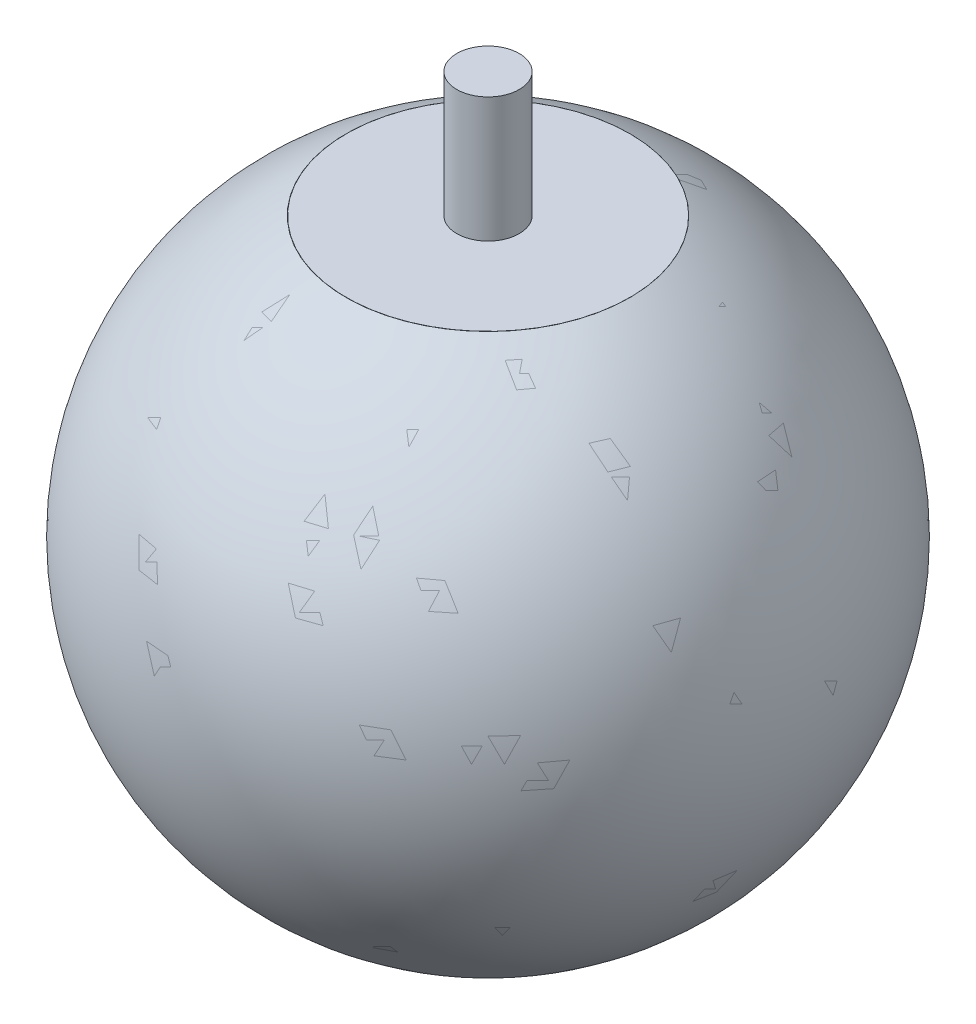
ISO-10303-21;
HEADER;
FILE_DESCRIPTION(('STEP AP214'),'2;1');
FILE_NAME('part.step','',(''),(''),'','','');
FILE_SCHEMA(('AUTOMOTIVE_DESIGN { 1 0 10303 214 1 1 1 1 }'));
ENDSEC;
DATA;
#1=APPLICATION_CONTEXT('core data for automotive mechanical design processes');
#2=APPLICATION_PROTOCOL_DEFINITION('international standard','automotive_design',2000,#1);
#3=PRODUCT_CONTEXT('',#1,'mechanical');
#4=PRODUCT('Part','Part','',(#3));
#5=PRODUCT_RELATED_PRODUCT_CATEGORY('part','',(#4));
#6=PRODUCT_DEFINITION_FORMATION('','',#4);
#7=PRODUCT_DEFINITION_CONTEXT('part definition',#1,'design');
#8=PRODUCT_DEFINITION('design','',#6,#7);
#9=PRODUCT_DEFINITION_SHAPE('','',#8);
#10=(LENGTH_UNIT() NAMED_UNIT(*) SI_UNIT(.MILLI.,.METRE.));
#11=(NAMED_UNIT(*) PLANE_ANGLE_UNIT() SI_UNIT($,.RADIAN.));
#12=(NAMED_UNIT(*) SI_UNIT($,.STERADIAN.) SOLID_ANGLE_UNIT());
#13=UNCERTAINTY_MEASURE_WITH_UNIT(LENGTH_MEASURE(1.E-05),#10,'distance_accuracy_value','');
#14=(GEOMETRIC_REPRESENTATION_CONTEXT(3) GLOBAL_UNCERTAINTY_ASSIGNED_CONTEXT((#13)) GLOBAL_UNIT_ASSIGNED_CONTEXT((#10,
#11,#12)) REPRESENTATION_CONTEXT('',''));
#15=CARTESIAN_POINT('',(0.,0.,0.));
#16=DIRECTION('',(0.,0.,1.));
#17=DIRECTION('',(1.,0.,0.));
#18=AXIS2_PLACEMENT_3D('',#15,#16,#17);
#19=CARTESIAN_POINT('',(0.,0.,0.));
#20=DIRECTION('',(0.,1.,0.));
#21=DIRECTION('',(1.,0.,0.));
#22=AXIS2_PLACEMENT_3D('',#19,#20,#21);
#23=SPHERICAL_SURFACE('',#22,5.);
#24=CARTESIAN_POINT('',(0.,4.45320017350555,0.));
#25=DIRECTION('',(0.,-1.,0.));
#26=DIRECTION('',(0.,0.,-1.));
#27=AXIS2_PLACEMENT_3D('',#24,#25,#26);
#28=CIRCLE('',#27,2.27354529637967);
#29=CARTESIAN_POINT('',(2.27354529637967,4.45320017350555,0.));
#30=VERTEX_POINT('',#29);
#31=EDGE_CURVE('E71',#30,#30,#28,.F.);
#32=CARTESIAN_POINT('',(0.,-4.45320017350555,0.));
#33=DIRECTION('',(0.,1.,0.));
#34=DIRECTION('',(0.,0.,1.));
#35=AXIS2_PLACEMENT_3D('',#32,#33,#34);
#36=CIRCLE('',#35,2.27354529637967);
#37=CARTESIAN_POINT('',(2.27354529637967,-4.45320017350555,0.));
#38=VERTEX_POINT('',#37);
#39=EDGE_CURVE('E12',#38,#38,#36,.F.);
#40=CARTESIAN_POINT('',(2.27354529637967,4.45320017350555,0.));
#41=CARTESIAN_POINT('',(2.37548531950764,4.40116297492504,0.));
#42=CARTESIAN_POINT('',(2.47563176308517,4.3456144261026,0.));
#43=CARTESIAN_POINT('',(2.67188043833875,4.22778152510552,0.));
#44=CARTESIAN_POINT('',(2.76798267001481,4.16549717293088,0.));
#45=CARTESIAN_POINT('',(2.95568586866488,4.03447956236102,0.));
#46=CARTESIAN_POINT('',(3.04728683563888,3.96574630396581,0.));
#47=CARTESIAN_POINT('',(3.22555677923094,3.82215668614564,0.));
#48=CARTESIAN_POINT('',(3.31222575584899,3.74730032672068,0.));
#49=CARTESIAN_POINT('',(3.4802228736232,3.59181689648685,0.));
#50=CARTESIAN_POINT('',(3.56155101477935,3.51118982567797,0.));
#51=CARTESIAN_POINT('',(3.71848315987481,3.34454517619218,0.));
#52=CARTESIAN_POINT('',(3.79408716381411,3.25852759751526,0.));
#53=CARTESIAN_POINT('',(3.93921461791893,3.08150738288072,0.));
#54=CARTESIAN_POINT('',(4.00873806808444,2.9905047469231,0.));
#55=CARTESIAN_POINT('',(4.1413766880278,2.80394341163364,0.));
#56=CARTESIAN_POINT('',(4.20449185780564,2.70838471230181,0.));
#57=CARTESIAN_POINT('',(4.32401639181203,2.51316170961223,0.));
#58=CARTESIAN_POINT('',(4.38042575604057,2.41349740625447,0.));
#59=CARTESIAN_POINT('',(4.48627276671289,2.21053301174686,0.));
#60=CARTESIAN_POINT('',(4.53571041315668,2.107232920597,0.));
#61=CARTESIAN_POINT('',(4.62738094005818,1.89748390492751,0.));
#62=CARTESIAN_POINT('',(4.66961382051589,1.79103498040788,0.));
#63=CARTESIAN_POINT('',(4.746675730505,1.57549009618591,0.));
#64=CARTESIAN_POINT('',(4.78150476003639,1.46639413648357,0.));
#65=CARTESIAN_POINT('',(4.84359478480409,1.24606945809454,0.));
#66=CARTESIAN_POINT('',(4.87085578004038,1.13484073940785,0.));
#67=CARTESIAN_POINT('',(4.91768122842387,0.910774873048633,0.));
#68=CARTESIAN_POINT('',(4.93724568157106,0.797937725376116,0.));
#69=CARTESIAN_POINT('',(4.96858581932792,0.571186913142093,0.));
#70=CARTESIAN_POINT('',(4.98036150393759,0.457273248580588,0.));
#71=CARTESIAN_POINT('',(4.99606859427363,0.228906389346055,0.));
#72=CARTESIAN_POINT('',(5.,0.114453194673028,0.));
#73=CARTESIAN_POINT('',(5.,-0.114453194673028,0.));
#74=CARTESIAN_POINT('',(4.99606859427363,-0.228906389346055,0.));
#75=CARTESIAN_POINT('',(4.98036150393759,-0.457273248580588,0.));
#76=CARTESIAN_POINT('',(4.96858581932792,-0.571186913142093,0.));
#77=CARTESIAN_POINT('',(4.93724568157105,-0.797937725376116,0.));
#78=CARTESIAN_POINT('',(4.91768122842387,-0.910774873048634,0.));
#79=CARTESIAN_POINT('',(4.87085578004038,-1.13484073940785,0.));
#80=CARTESIAN_POINT('',(4.84359478480409,-1.24606945809454,0.));
#81=CARTESIAN_POINT('',(4.78150476003639,-1.46639413648357,0.));
#82=CARTESIAN_POINT('',(4.746675730505,-1.57549009618591,0.));
#83=CARTESIAN_POINT('',(4.66961382051589,-1.79103498040788,0.));
#84=CARTESIAN_POINT('',(4.62738094005818,-1.89748390492751,0.));
#85=CARTESIAN_POINT('',(4.53571041315668,-2.107232920597,0.));
#86=CARTESIAN_POINT('',(4.48627276671289,-2.21053301174686,0.));
#87=CARTESIAN_POINT('',(4.38042575604057,-2.41349740625447,0.));
#88=CARTESIAN_POINT('',(4.32401639181203,-2.51316170961223,0.));
#89=CARTESIAN_POINT('',(4.20449185780564,-2.70838471230181,0.));
#90=CARTESIAN_POINT('',(4.1413766880278,-2.80394341163364,0.));
#91=CARTESIAN_POINT('',(4.00873806808444,-2.9905047469231,0.));
#92=CARTESIAN_POINT('',(3.93921461791893,-3.08150738288072,0.));
#93=CARTESIAN_POINT('',(3.79408716381411,-3.25852759751526,0.));
#94=CARTESIAN_POINT('',(3.71848315987481,-3.34454517619218,0.));
#95=CARTESIAN_POINT('',(3.56155101477935,-3.51118982567797,0.));
#96=CARTESIAN_POINT('',(3.4802228736232,-3.59181689648685,0.));
#97=CARTESIAN_POINT('',(3.31222575584899,-3.74730032672068,0.));
#98=CARTESIAN_POINT('',(3.22555677923094,-3.82215668614564,0.));
#99=CARTESIAN_POINT('',(3.04728683563888,-3.96574630396581,0.));
#100=CARTESIAN_POINT('',(2.95568586866488,-4.03447956236102,0.));
#101=CARTESIAN_POINT('',(2.76798267001481,-4.16549717293088,0.));
#102=CARTESIAN_POINT('',(2.67188043833875,-4.22778152510552,0.));
#103=CARTESIAN_POINT('',(2.47563176308517,-4.3456144261026,0.));
#104=CARTESIAN_POINT('',(2.37548531950764,-4.40116297492504,0.));
#105=CARTESIAN_POINT('',(2.27354529637967,-4.45320017350555,0.));
#106=B_SPLINE_CURVE_WITH_KNOTS('',3,(#40,#41,#42,#43,#44,#45,#46,#47,#48,#49,#50,#51,#52,#53,
#54,#55,#56,#57,#58,#59,#60,#61,#62,#63,#64,#65,#66,#67,#68,#69,#70,#71,#72,#73,#74,#75,#76,#77,
#78,#79,#80,#81,#82,#83,#84,#85,#86,#87,#88,#89,#90,#91,#92,#93,#94,#95,#96,#97,#98,#99,#100,
#101,#102,#103,#104,#105),.UNSPECIFIED.,.F.,.F.,(4,2,2,2,2,2,2,2,2,2,2,2,2,2,2,2,2,2,2,2,2,2,2,
2,2,2,2,2,2,2,2,2,4),(0.,0.343292162660128,0.686584325320256,1.02987648798038,1.37316865064051,
1.71646081330064,2.05975297596077,2.4030451386209,2.74633730128102,3.08962946394115,
3.43292162660128,3.77621378926141,4.11950595192154,4.46279811458166,4.80609027724179,
5.14938243990192,5.49267460256205,5.83596676522217,6.1792589278823,6.52255109054243,
6.86584325320256,7.20913541586268,7.55242757852281,7.89571974118294,8.23901190384307,
8.5823040665032,8.92559622916333,9.26888839182345,9.61218055448358,9.95547271714371,
10.2987648798038,10.642057042464,10.9853492051241),.UNSPECIFIED.);
#107=EDGE_CURVE('BSEAM67',#30,#38,#106,.T.);
#108=ORIENTED_EDGE('',*,*,#31,.F.);
#109=ORIENTED_EDGE('',*,*,#39,.F.);
#110=ORIENTED_EDGE('',*,*,#107,.T.);
#111=ORIENTED_EDGE('',*,*,#107,.F.);
#112=EDGE_LOOP('',(#108,#110,#109,#111));
#113=FACE_BOUND('',#112,.T.);
#114=ADVANCED_FACE('F67',(#113),#23,.T.);
#115=OPEN_SHELL('',(#114));
#116=SHELL_BASED_SURFACE_MODEL('B2',(#115));
#117=CARTESIAN_POINT('',(0.,6.45320017350555,0.));
#118=DIRECTION('',(0.,1.,0.));
#119=DIRECTION('',(0.,0.,1.));
#120=AXIS2_PLACEMENT_3D('',#117,#118,#119);
#121=CYLINDRICAL_SURFACE('',#120,0.5);
#122=CARTESIAN_POINT('',(0.,4.45320017350555,0.));
#123=DIRECTION('',(0.,1.,0.));
#124=DIRECTION('',(0.,0.,1.));
#125=AXIS2_PLACEMENT_3D('',#122,#123,#124);
#126=CIRCLE('',#125,0.5);
#127=CARTESIAN_POINT('',(0.,4.45320017350555,0.5));
#128=VERTEX_POINT('',#127);
#129=EDGE_CURVE('E66',#128,#128,#126,.F.);
#130=ORIENTED_EDGE('',*,*,#129,.F.);
#131=EDGE_LOOP('',(#130));
#132=FACE_BOUND('',#131,.T.);
#133=CARTESIAN_POINT('',(0.,6.45320017350555,0.));
#134=DIRECTION('',(0.,1.,0.));
#135=DIRECTION('',(0.,0.,1.));
#136=AXIS2_PLACEMENT_3D('',#133,#134,#135);
#137=CIRCLE('',#136,0.5);
#138=CARTESIAN_POINT('',(0.,6.45320017350555,0.5));
#139=VERTEX_POINT('',#138);
#140=EDGE_CURVE('E110',#139,#139,#137,.T.);
#141=ORIENTED_EDGE('',*,*,#140,.F.);
#142=EDGE_LOOP('',(#141));
#143=FACE_BOUND('',#142,.T.);
#144=ADVANCED_FACE('F99',(#132,#143),#121,.T.);
#145=CARTESIAN_POINT('',(0.,6.45320017350555,0.5));
#146=DIRECTION('',(0.,1.,0.));
#147=DIRECTION('',(0.,0.,1.));
#148=AXIS2_PLACEMENT_3D('',#145,#146,#147);
#149=PLANE('',#148);
#150=ORIENTED_EDGE('',*,*,#140,.T.);
#151=EDGE_LOOP('',(#150));
#152=FACE_BOUND('',#151,.T.);
#153=ADVANCED_FACE('F131',(#152),#149,.T.);
#154=CARTESIAN_POINT('',(0.,4.34062112897565,-0.00179623223960914));
#155=DIRECTION('',(0.,-1.,0.));
#156=DIRECTION('',(0.,0.,-1.));
#157=AXIS2_PLACEMENT_3D('',#154,#155,#156);
#158=CYLINDRICAL_SURFACE('',#157,2.27174906414006);
#159=CARTESIAN_POINT('',(0.,4.45320017350555,-0.00179623223960914));
#160=DIRECTION('',(0.,-1.,0.));
#161=DIRECTION('',(0.,0.,-1.));
#162=AXIS2_PLACEMENT_3D('',#159,#160,#161);
#163=CIRCLE('',#162,2.27174906414006);
#164=CARTESIAN_POINT('',(0.,4.45320017350555,-2.27354529637967));
#165=VERTEX_POINT('',#164);
#166=EDGE_CURVE('E119',#165,#165,#163,.T.);
#167=ORIENTED_EDGE('',*,*,#166,.T.);
#168=EDGE_LOOP('',(#167));
#169=FACE_BOUND('',#168,.T.);
#170=CARTESIAN_POINT('',(0.,4.34062112897565,-0.00179623223960914));
#171=DIRECTION('',(0.,-1.,0.));
#172=DIRECTION('',(0.,0.,-1.));
#173=AXIS2_PLACEMENT_3D('',#170,#171,#172);
#174=CIRCLE('',#173,2.27174906414006);
#175=CARTESIAN_POINT('',(0.,4.34062112897565,-2.27354529637967));
#176=VERTEX_POINT('',#175);
#177=EDGE_CURVE('E122',#176,#176,#174,.T.);
#178=ORIENTED_EDGE('',*,*,#177,.F.);
#179=EDGE_LOOP('',(#178));
#180=FACE_BOUND('',#179,.T.);
#181=ADVANCED_FACE('F128',(#169,#180),#158,.T.);
#182=CARTESIAN_POINT('',(0.,4.45320017350555,-0.00179623223960914));
#183=DIRECTION('',(0.,1.,0.));
#184=DIRECTION('',(0.,0.,1.));
#185=AXIS2_PLACEMENT_3D('',#182,#183,#184);
#186=PLANE('',#185);
#187=ORIENTED_EDGE('',*,*,#129,.T.);
#188=EDGE_LOOP('',(#187));
#189=FACE_BOUND('',#188,.T.);
#190=ORIENTED_EDGE('',*,*,#166,.F.);
#191=EDGE_LOOP('',(#190));
#192=FACE_BOUND('',#191,.T.);
#193=ADVANCED_FACE('F130',(#189,#192),#186,.T.);
#194=CARTESIAN_POINT('',(0.,4.34062112897565,-0.00179623223960914));
#195=DIRECTION('',(0.,-1.,0.));
#196=DIRECTION('',(0.,0.,-1.));
#197=AXIS2_PLACEMENT_3D('',#194,#195,#196);
#198=PLANE('',#197);
#199=CARTESIAN_POINT('',(0.,4.34062112897565,0.));
#200=DIRECTION('',(0.,-1.,0.));
#201=DIRECTION('',(0.,0.,-1.));
#202=AXIS2_PLACEMENT_3D('',#199,#200,#201);
#203=CIRCLE('',#202,0.5);
#204=CARTESIAN_POINT('',(0.,4.34062112897565,-0.5));
#205=VERTEX_POINT('',#204);
#206=EDGE_CURVE('E106',#205,#205,#203,.F.);
#207=ORIENTED_EDGE('',*,*,#206,.T.);
#208=EDGE_LOOP('',(#207));
#209=FACE_BOUND('',#208,.T.);
#210=ORIENTED_EDGE('',*,*,#177,.T.);
#211=EDGE_LOOP('',(#210));
#212=FACE_BOUND('',#211,.T.);
#213=ADVANCED_FACE('F126',(#209,#212),#198,.T.);
#214=CARTESIAN_POINT('',(0.,2.45320017350555,0.5));
#215=DIRECTION('',(0.,-1.,0.));
#216=DIRECTION('',(0.,0.,-1.));
#217=AXIS2_PLACEMENT_3D('',#214,#215,#216);
#218=PLANE('',#217);
#219=CARTESIAN_POINT('',(0.,2.45320017350555,0.));
#220=DIRECTION('',(0.,1.,0.));
#221=DIRECTION('',(0.,0.,1.));
#222=AXIS2_PLACEMENT_3D('',#219,#220,#221);
#223=CIRCLE('',#222,0.5);
#224=CARTESIAN_POINT('',(0.,2.45320017350555,0.5));
#225=VERTEX_POINT('',#224);
#226=EDGE_CURVE('E114',#225,#225,#223,.T.);
#227=ORIENTED_EDGE('',*,*,#226,.F.);
#228=EDGE_LOOP('',(#227));
#229=FACE_BOUND('',#228,.T.);
#230=ADVANCED_FACE('F148',(#229),#218,.T.);
#231=ORIENTED_EDGE('',*,*,#206,.F.);
#232=EDGE_LOOP('',(#231));
#233=FACE_BOUND('',#232,.T.);
#234=ORIENTED_EDGE('',*,*,#226,.T.);
#235=EDGE_LOOP('',(#234));
#236=FACE_BOUND('',#235,.T.);
#237=ADVANCED_FACE('F101',(#233,#236),#121,.T.);
#238=CLOSED_SHELL('',(#144,#153,#181,#193,#213,#230,#237));
#239=MANIFOLD_SOLID_BREP('B7',#238);
#240=CARTESIAN_POINT('',(0.,0.,0.));
#241=DIRECTION('',(0.,1.,0.));
#242=DIRECTION('',(1.,0.,0.));
#243=AXIS2_PLACEMENT_3D('',#240,#241,#242);
#244=SPHERICAL_SURFACE('',#243,4.9);
#245=CARTESIAN_POINT('',(0.,4.34062112897565,0.));
#246=DIRECTION('',(0.,-1.,0.));
#247=DIRECTION('',(0.,0.,-1.));
#248=AXIS2_PLACEMENT_3D('',#245,#246,#247);
#249=CIRCLE('',#248,2.27354529637967);
#250=CARTESIAN_POINT('',(2.27354529637967,4.34062112897565,0.));
#251=VERTEX_POINT('',#250);
#252=EDGE_CURVE('E214',#251,#251,#249,.F.);
#253=CARTESIAN_POINT('',(0.,-4.34062112897565,0.));
#254=DIRECTION('',(0.,1.,0.));
#255=DIRECTION('',(0.,0.,1.));
#256=AXIS2_PLACEMENT_3D('',#253,#254,#255);
#257=CIRCLE('',#256,2.27354529637967);
#258=CARTESIAN_POINT('',(2.27354529637967,-4.34062112897565,0.));
#259=VERTEX_POINT('',#258);
#260=EDGE_CURVE('E202',#259,#259,#257,.F.);
#261=CARTESIAN_POINT('',(2.27354529637967,4.34062112897565,0.));
#262=CARTESIAN_POINT('',(2.37196342909985,4.28907841504898,0.));
#263=CARTESIAN_POINT('',(2.46862207438421,4.23417810488173,0.));
#264=CARTESIAN_POINT('',(2.65798777674958,4.11793967651108,0.));
#265=CARTESIAN_POINT('',(2.75069483383059,4.05660155830768,0.));
#266=CARTESIAN_POINT('',(2.9317247464576,3.92776489830973,0.));
#267=CARTESIAN_POINT('',(3.0200476020036,3.86026635651518,0.));
#268=CARTESIAN_POINT('',(3.19190167112037,3.7194227022876,0.));
#269=CARTESIAN_POINT('',(3.27543288469116,3.64607758985456,0.));
#270=CARTESIAN_POINT('',(3.43731707768118,3.49387954885925,0.));
#271=CARTESIAN_POINT('',(3.51567005710041,3.41502662029697,0.));
#272=CARTESIAN_POINT('',(3.66683548947013,3.25217774686349,0.));
#273=CARTESIAN_POINT('',(3.7396479424206,3.1681818019923,0.));
#274=CARTESIAN_POINT('',(3.87939555914006,2.99543532769107,0.));
#275=CARTESIAN_POINT('',(3.94633072290903,2.90668479826104,0.));
#276=CARTESIAN_POINT('',(4.07401420506352,2.72483961670379,0.));
#277=CARTESIAN_POINT('',(4.13476252344905,2.63174496457658,0.));
#278=CARTESIAN_POINT('',(4.24979136477427,2.44164207915262,0.));
#279=CARTESIAN_POINT('',(4.30407188771398,2.34463384585588,0.));
#280=CARTESIAN_POINT('',(4.40591410213768,2.14715244209103,0.));
#281=CARTESIAN_POINT('',(4.45347579362168,2.04667927162293,0.));
#282=CARTESIAN_POINT('',(4.54166038186919,1.842732661353,0.));
#283=CARTESIAN_POINT('',(4.5822832786327,1.73925922155118,0.));
#284=CARTESIAN_POINT('',(4.65640240482072,1.52979061629968,0.));
#285=CARTESIAN_POINT('',(4.68989863424523,1.42379545085,0.));
#286=CARTESIAN_POINT('',(4.74960951249071,1.20977360040074,0.));
#287=CARTESIAN_POINT('',(4.77582416131168,1.10174691540116,0.));
#288=CARTESIAN_POINT('',(4.82085064092609,0.884161627330543,0.));
#289=CARTESIAN_POINT('',(4.83966247171953,0.774603024259506,0.));
#290=CARTESIAN_POINT('',(4.8697963143821,0.554460586330249,0.));
#291=CARTESIAN_POINT('',(4.88111832625122,0.44387675147203,0.));
#292=CARTESIAN_POINT('',(4.89622016906017,0.222195277742541,0.));
#293=CARTESIAN_POINT('',(4.9,0.11109763887127,0.));
#294=CARTESIAN_POINT('',(4.9,-0.11109763887127,0.));
#295=CARTESIAN_POINT('',(4.89622016906017,-0.222195277742541,0.));
#296=CARTESIAN_POINT('',(4.88111832625122,-0.44387675147203,0.));
#297=CARTESIAN_POINT('',(4.8697963143821,-0.554460586330249,0.));
#298=CARTESIAN_POINT('',(4.83966247171953,-0.774603024259506,0.));
#299=CARTESIAN_POINT('',(4.82085064092609,-0.884161627330543,0.));
#300=CARTESIAN_POINT('',(4.77582416131168,-1.10174691540116,0.));
#301=CARTESIAN_POINT('',(4.74960951249071,-1.20977360040074,0.));
#302=CARTESIAN_POINT('',(4.68989863424523,-1.42379545085,0.));
#303=CARTESIAN_POINT('',(4.65640240482072,-1.52979061629968,0.));
#304=CARTESIAN_POINT('',(4.5822832786327,-1.73925922155118,0.));
#305=CARTESIAN_POINT('',(4.54166038186919,-1.842732661353,0.));
#306=CARTESIAN_POINT('',(4.45347579362168,-2.04667927162293,0.));
#307=CARTESIAN_POINT('',(4.40591410213768,-2.14715244209103,0.));
#308=CARTESIAN_POINT('',(4.30407188771398,-2.34463384585588,0.));
#309=CARTESIAN_POINT('',(4.24979136477427,-2.44164207915262,0.));
#310=CARTESIAN_POINT('',(4.13476252344905,-2.63174496457658,0.));
#311=CARTESIAN_POINT('',(4.07401420506352,-2.72483961670379,0.));
#312=CARTESIAN_POINT('',(3.94633072290903,-2.90668479826104,0.));
#313=CARTESIAN_POINT('',(3.87939555914006,-2.99543532769107,0.));
#314=CARTESIAN_POINT('',(3.7396479424206,-3.1681818019923,0.));
#315=CARTESIAN_POINT('',(3.66683548947012,-3.25217774686349,0.));
#316=CARTESIAN_POINT('',(3.51567005710041,-3.41502662029697,0.));
#317=CARTESIAN_POINT('',(3.43731707768118,-3.49387954885925,0.));
#318=CARTESIAN_POINT('',(3.27543288469116,-3.64607758985456,0.));
#319=CARTESIAN_POINT('',(3.19190167112037,-3.7194227022876,0.));
#320=CARTESIAN_POINT('',(3.0200476020036,-3.86026635651518,0.));
#321=CARTESIAN_POINT('',(2.9317247464576,-3.92776489830973,0.));
#322=CARTESIAN_POINT('',(2.7506948338306,-4.05660155830768,0.));
#323=CARTESIAN_POINT('',(2.65798777674958,-4.11793967651108,0.));
#324=CARTESIAN_POINT('',(2.46862207438421,-4.23417810488173,0.));
#325=CARTESIAN_POINT('',(2.37196342909985,-4.28907841504898,0.));
#326=CARTESIAN_POINT('',(2.27354529637967,-4.34062112897565,0.));
#327=B_SPLINE_CURVE_WITH_KNOTS('',3,(#261,#262,#263,#264,#265,#266,#267,#268,#269,#270,#271,
#272,#273,#274,#275,#276,#277,#278,#279,#280,#281,#282,#283,#284,#285,#286,#287,#288,#289,#290,
#291,#292,#293,#294,#295,#296,#297,#298,#299,#300,#301,#302,#303,#304,#305,#306,#307,#308,#309,
#310,#311,#312,#313,#314,#315,#316,#317,#318,#319,#320,#321,#322,#323,#324,#325,#326),
.UNSPECIFIED.,.F.,.F.,(4,2,2,2,2,2,2,2,2,2,2,2,2,2,2,2,2,2,2,2,2,2,2,2,2,2,2,2,2,2,2,2,4),(0.,
0.333228709708801,0.666457419417601,0.999686129126401,1.3329148388352,1.666143548544,
1.9993722582528,2.3326009679616,2.6658296776704,2.99905838737921,3.33228709708801,
3.66551580679681,3.99874451650561,4.33197322621441,4.66520193592321,4.99843064563201,
5.33165935534081,5.66488806504961,5.99811677475841,6.33134548446721,6.66457419417601,
6.99780290388481,7.33103161359361,7.66426032330241,7.99748903301121,8.33071774272002,
8.66394645242882,8.99717516213762,9.33040387184642,9.66363258155522,9.99686129126402,
10.3300900009728,10.6633187106816),.UNSPECIFIED.);
#328=EDGE_CURVE('BSEAM199',#251,#259,#327,.T.);
#329=ORIENTED_EDGE('',*,*,#252,.T.);
#330=ORIENTED_EDGE('',*,*,#260,.T.);
#331=ORIENTED_EDGE('',*,*,#328,.T.);
#332=ORIENTED_EDGE('',*,*,#328,.F.);
#333=EDGE_LOOP('',(#329,#331,#330,#332));
#334=FACE_BOUND('',#333,.T.);
#335=ADVANCED_FACE('F199',(#334),#244,.F.);
#336=CARTESIAN_POINT('',(0.,10.,0.));
#337=DIRECTION('',(0.,-1.,0.));
#338=DIRECTION('',(0.,0.,-1.));
#339=AXIS2_PLACEMENT_3D('',#336,#337,#338);
#340=CYLINDRICAL_SURFACE('',#339,2.27354529637967);
#341=ORIENTED_EDGE('',*,*,#252,.F.);
#342=EDGE_LOOP('',(#341));
#343=FACE_BOUND('',#342,.T.);
#344=CARTESIAN_POINT('',(0.,4.45320017350555,0.));
#345=DIRECTION('',(0.,-1.,0.));
#346=DIRECTION('',(0.,0.,-1.));
#347=AXIS2_PLACEMENT_3D('',#344,#345,#346);
#348=CIRCLE('',#347,2.27354529637967);
#349=CARTESIAN_POINT('',(2.27354529637967,4.45320017350555,0.));
#350=VERTEX_POINT('',#349);
#351=EDGE_CURVE('E207',#350,#350,#348,.F.);
#352=ORIENTED_EDGE('',*,*,#351,.T.);
#353=EDGE_LOOP('',(#352));
#354=FACE_BOUND('',#353,.T.);
#355=ADVANCED_FACE('F227',(#343,#354),#340,.F.);
#356=ORIENTED_EDGE('',*,*,#260,.F.);
#357=EDGE_LOOP('',(#356));
#358=FACE_BOUND('',#357,.T.);
#359=CARTESIAN_POINT('',(0.,-4.45320017350555,0.));
#360=DIRECTION('',(0.,1.,0.));
#361=DIRECTION('',(0.,0.,1.));
#362=AXIS2_PLACEMENT_3D('',#359,#360,#361);
#363=CIRCLE('',#362,2.27354529637967);
#364=CARTESIAN_POINT('',(2.27354529637967,-4.45320017350555,0.));
#365=VERTEX_POINT('',#364);
#366=EDGE_CURVE('E98',#365,#365,#363,.F.);
#367=ORIENTED_EDGE('',*,*,#366,.T.);
#368=EDGE_LOOP('',(#367));
#369=FACE_BOUND('',#368,.T.);
#370=ADVANCED_FACE('F224',(#358,#369),#340,.F.);
#371=CARTESIAN_POINT('',(0.,0.,0.));
#372=DIRECTION('',(0.,1.,0.));
#373=DIRECTION('',(1.,0.,0.));
#374=AXIS2_PLACEMENT_3D('',#371,#372,#373);
#375=SPHERICAL_SURFACE('',#374,5.);
#376=CARTESIAN_POINT('',(2.27354529637967,4.45320017350555,0.));
#377=CARTESIAN_POINT('',(2.37548531950764,4.40116297492504,0.));
#378=CARTESIAN_POINT('',(2.47563176308517,4.3456144261026,0.));
#379=CARTESIAN_POINT('',(2.67188043833875,4.22778152510552,0.));
#380=CARTESIAN_POINT('',(2.76798267001481,4.16549717293088,0.));
#381=CARTESIAN_POINT('',(2.95568586866488,4.03447956236102,0.));
#382=CARTESIAN_POINT('',(3.04728683563888,3.96574630396581,0.));
#383=CARTESIAN_POINT('',(3.22555677923094,3.82215668614564,0.));
#384=CARTESIAN_POINT('',(3.31222575584899,3.74730032672068,0.));
#385=CARTESIAN_POINT('',(3.4802228736232,3.59181689648685,0.));
#386=CARTESIAN_POINT('',(3.56155101477935,3.51118982567797,0.));
#387=CARTESIAN_POINT('',(3.71848315987481,3.34454517619218,0.));
#388=CARTESIAN_POINT('',(3.79408716381411,3.25852759751526,0.));
#389=CARTESIAN_POINT('',(3.93921461791893,3.08150738288072,0.));
#390=CARTESIAN_POINT('',(4.00873806808444,2.9905047469231,0.));
#391=CARTESIAN_POINT('',(4.1413766880278,2.80394341163364,0.));
#392=CARTESIAN_POINT('',(4.20449185780564,2.70838471230181,0.));
#393=CARTESIAN_POINT('',(4.32401639181203,2.51316170961223,0.));
#394=CARTESIAN_POINT('',(4.38042575604057,2.41349740625447,0.));
#395=CARTESIAN_POINT('',(4.48627276671289,2.21053301174686,0.));
#396=CARTESIAN_POINT('',(4.53571041315668,2.107232920597,0.));
#397=CARTESIAN_POINT('',(4.62738094005818,1.89748390492751,0.));
#398=CARTESIAN_POINT('',(4.66961382051589,1.79103498040788,0.));
#399=CARTESIAN_POINT('',(4.746675730505,1.57549009618591,0.));
#400=CARTESIAN_POINT('',(4.78150476003639,1.46639413648357,0.));
#401=CARTESIAN_POINT('',(4.84359478480409,1.24606945809454,0.));
#402=CARTESIAN_POINT('',(4.87085578004038,1.13484073940785,0.));
#403=CARTESIAN_POINT('',(4.91768122842387,0.910774873048633,0.));
#404=CARTESIAN_POINT('',(4.93724568157106,0.797937725376116,0.));
#405=CARTESIAN_POINT('',(4.96858581932792,0.571186913142093,0.));
#406=CARTESIAN_POINT('',(4.98036150393759,0.457273248580588,0.));
#407=CARTESIAN_POINT('',(4.99606859427363,0.228906389346055,0.));
#408=CARTESIAN_POINT('',(5.,0.114453194673028,0.));
#409=CARTESIAN_POINT('',(5.,-0.114453194673028,0.));
#410=CARTESIAN_POINT('',(4.99606859427363,-0.228906389346055,0.));
#411=CARTESIAN_POINT('',(4.98036150393759,-0.457273248580588,0.));
#412=CARTESIAN_POINT('',(4.96858581932792,-0.571186913142093,0.));
#413=CARTESIAN_POINT('',(4.93724568157105,-0.797937725376116,0.));
#414=CARTESIAN_POINT('',(4.91768122842387,-0.910774873048634,0.));
#415=CARTESIAN_POINT('',(4.87085578004038,-1.13484073940785,0.));
#416=CARTESIAN_POINT('',(4.84359478480409,-1.24606945809454,0.));
#417=CARTESIAN_POINT('',(4.78150476003639,-1.46639413648357,0.));
#418=CARTESIAN_POINT('',(4.746675730505,-1.57549009618591,0.));
#419=CARTESIAN_POINT('',(4.66961382051589,-1.79103498040788,0.));
#420=CARTESIAN_POINT('',(4.62738094005818,-1.89748390492751,0.));
#421=CARTESIAN_POINT('',(4.53571041315668,-2.107232920597,0.));
#422=CARTESIAN_POINT('',(4.48627276671289,-2.21053301174686,0.));
#423=CARTESIAN_POINT('',(4.38042575604057,-2.41349740625447,0.));
#424=CARTESIAN_POINT('',(4.32401639181203,-2.51316170961223,0.));
#425=CARTESIAN_POINT('',(4.20449185780564,-2.70838471230181,0.));
#426=CARTESIAN_POINT('',(4.1413766880278,-2.80394341163364,0.));
#427=CARTESIAN_POINT('',(4.00873806808444,-2.9905047469231,0.));
#428=CARTESIAN_POINT('',(3.93921461791893,-3.08150738288072,0.));
#429=CARTESIAN_POINT('',(3.79408716381411,-3.25852759751526,0.));
#430=CARTESIAN_POINT('',(3.71848315987481,-3.34454517619218,0.));
#431=CARTESIAN_POINT('',(3.56155101477935,-3.51118982567797,0.));
#432=CARTESIAN_POINT('',(3.4802228736232,-3.59181689648685,0.));
#433=CARTESIAN_POINT('',(3.31222575584899,-3.74730032672068,0.));
#434=CARTESIAN_POINT('',(3.22555677923094,-3.82215668614564,0.));
#435=CARTESIAN_POINT('',(3.04728683563888,-3.96574630396581,0.));
#436=CARTESIAN_POINT('',(2.95568586866488,-4.03447956236102,0.));
#437=CARTESIAN_POINT('',(2.76798267001481,-4.16549717293088,0.));
#438=CARTESIAN_POINT('',(2.67188043833875,-4.22778152510552,0.));
#439=CARTESIAN_POINT('',(2.47563176308517,-4.3456144261026,0.));
#440=CARTESIAN_POINT('',(2.37548531950764,-4.40116297492504,0.));
#441=CARTESIAN_POINT('',(2.27354529637967,-4.45320017350555,0.));
#442=B_SPLINE_CURVE_WITH_KNOTS('',3,(#376,#377,#378,#379,#380,#381,#382,#383,#384,#385,#386,
#387,#388,#389,#390,#391,#392,#393,#394,#395,#396,#397,#398,#399,#400,#401,#402,#403,#404,#405,
#406,#407,#408,#409,#410,#411,#412,#413,#414,#415,#416,#417,#418,#419,#420,#421,#422,#423,#424,
#425,#426,#427,#428,#429,#430,#431,#432,#433,#434,#435,#436,#437,#438,#439,#440,#441),
.UNSPECIFIED.,.F.,.F.,(4,2,2,2,2,2,2,2,2,2,2,2,2,2,2,2,2,2,2,2,2,2,2,2,2,2,2,2,2,2,2,2,4),(0.,
0.343292162660128,0.686584325320256,1.02987648798038,1.37316865064051,1.71646081330064,
2.05975297596077,2.4030451386209,2.74633730128102,3.08962946394115,3.43292162660128,
3.77621378926141,4.11950595192154,4.46279811458166,4.80609027724179,5.14938243990192,
5.49267460256205,5.83596676522217,6.1792589278823,6.52255109054243,6.86584325320256,
7.20913541586268,7.55242757852281,7.89571974118294,8.23901190384307,8.5823040665032,
8.92559622916333,9.26888839182345,9.61218055448358,9.95547271714371,10.2987648798038,
10.642057042464,10.9853492051241),.UNSPECIFIED.);
#443=EDGE_CURVE('BSEAM226',#350,#365,#442,.T.);
#444=ORIENTED_EDGE('',*,*,#351,.F.);
#445=ORIENTED_EDGE('',*,*,#366,.F.);
#446=ORIENTED_EDGE('',*,*,#443,.T.);
#447=ORIENTED_EDGE('',*,*,#443,.F.);
#448=EDGE_LOOP('',(#444,#446,#445,#447));
#449=FACE_BOUND('',#448,.T.);
#450=ADVANCED_FACE('F226',(#449),#375,.T.);
#451=CLOSED_SHELL('',(#335,#355,#370,#450));
#452=MANIFOLD_SOLID_BREP('B61',#451);
#453=ADVANCED_BREP_SHAPE_REPRESENTATION('',(#18,#239,#452),#14);
#454=MANIFOLD_SURFACE_SHAPE_REPRESENTATION('',(#18,#116),#14);
#455=SHAPE_REPRESENTATION('',(#18),#14);
#456=SHAPE_DEFINITION_REPRESENTATION(#9,#455);
#457=SHAPE_REPRESENTATION_RELATIONSHIP('','',#455,#453);
#458=SHAPE_REPRESENTATION_RELATIONSHIP('','',#455,#454);
ENDSEC;
END-ISO-10303-21;
